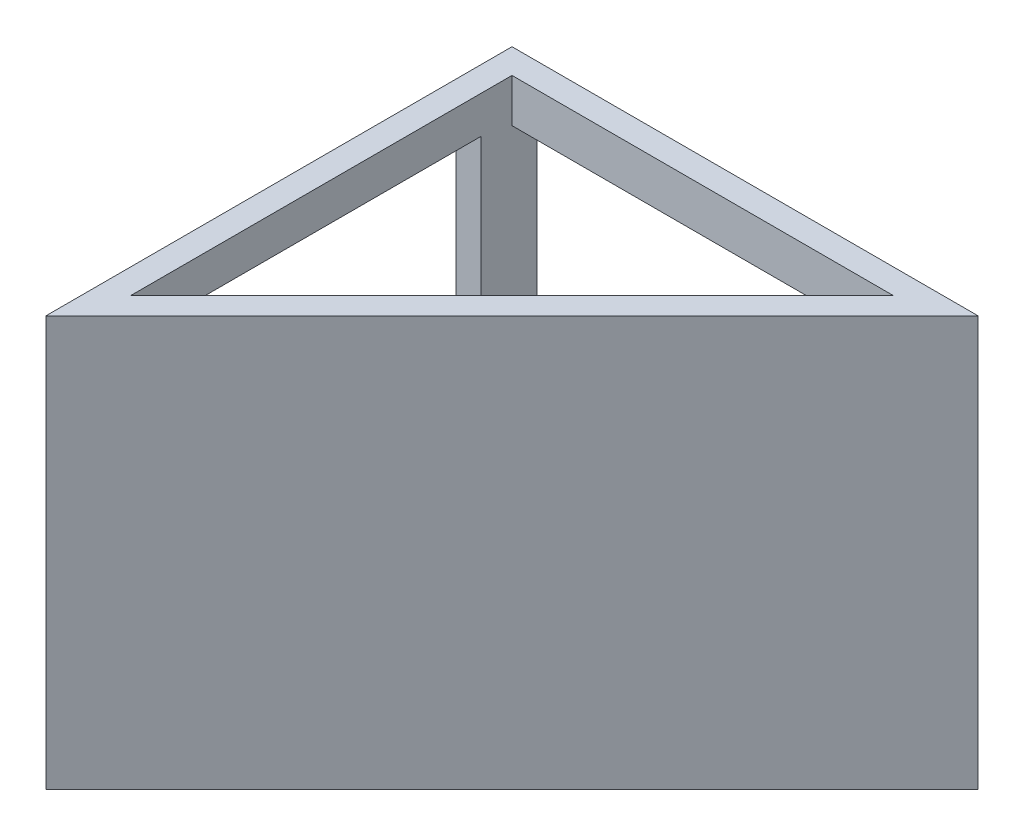
ISO-10303-21;
HEADER;
FILE_DESCRIPTION(('STEP AP214'),'2;1');
FILE_NAME('part.step','',(''),(''),'','','');
FILE_SCHEMA(('AUTOMOTIVE_DESIGN { 1 0 10303 214 1 1 1 1 }'));
ENDSEC;
DATA;
#1=APPLICATION_CONTEXT('core data for automotive mechanical design processes');
#2=APPLICATION_PROTOCOL_DEFINITION('international standard','automotive_design',2000,#1);
#3=PRODUCT_CONTEXT('',#1,'mechanical');
#4=PRODUCT('Part','Part','',(#3));
#5=PRODUCT_RELATED_PRODUCT_CATEGORY('part','',(#4));
#6=PRODUCT_DEFINITION_FORMATION('','',#4);
#7=PRODUCT_DEFINITION_CONTEXT('part definition',#1,'design');
#8=PRODUCT_DEFINITION('design','',#6,#7);
#9=PRODUCT_DEFINITION_SHAPE('','',#8);
#10=(LENGTH_UNIT() NAMED_UNIT(*) SI_UNIT(.MILLI.,.METRE.));
#11=(NAMED_UNIT(*) PLANE_ANGLE_UNIT() SI_UNIT($,.RADIAN.));
#12=(NAMED_UNIT(*) SI_UNIT($,.STERADIAN.) SOLID_ANGLE_UNIT());
#13=UNCERTAINTY_MEASURE_WITH_UNIT(LENGTH_MEASURE(1.E-05),#10,'distance_accuracy_value','');
#14=(GEOMETRIC_REPRESENTATION_CONTEXT(3) GLOBAL_UNCERTAINTY_ASSIGNED_CONTEXT((#13)) GLOBAL_UNIT_ASSIGNED_CONTEXT((#10,
#11,#12)) REPRESENTATION_CONTEXT('',''));
#15=CARTESIAN_POINT('',(0.,0.,0.));
#16=DIRECTION('',(0.,0.,1.));
#17=DIRECTION('',(1.,0.,0.));
#18=AXIS2_PLACEMENT_3D('',#15,#16,#17);
#19=CARTESIAN_POINT('',(2.,33.,2.));
#20=DIRECTION('',(1.,0.,0.));
#21=DIRECTION('',(0.,0.,-1.));
#22=AXIS2_PLACEMENT_3D('',#19,#20,#21);
#23=PLANE('',#22);
#24=DIRECTION('',(0.,-1.,0.));
#25=VECTOR('',#24,1.);
#26=CARTESIAN_POINT('',(2.,33.,32.6715728752538));
#27=LINE('',#26,#25);
#28=CARTESIAN_POINT('',(2.,33.,32.6715728752538));
#29=VERTEX_POINT('',#28);
#30=CARTESIAN_POINT('',(2.,30.,32.6715728752538));
#31=VERTEX_POINT('',#30);
#32=EDGE_CURVE('E238',#29,#31,#27,.T.);
#33=ORIENTED_EDGE('',*,*,#32,.T.);
#34=DIRECTION('',(0.,0.,-1.));
#35=VECTOR('',#34,1.);
#36=CARTESIAN_POINT('',(2.,30.,4.5));
#37=LINE('',#36,#35);
#38=CARTESIAN_POINT('',(2.,30.,4.5));
#39=VERTEX_POINT('',#38);
#40=EDGE_CURVE('E166',#31,#39,#37,.T.);
#41=ORIENTED_EDGE('',*,*,#40,.T.);
#42=DIRECTION('',(0.,-1.,0.));
#43=VECTOR('',#42,1.);
#44=CARTESIAN_POINT('',(2.,30.,4.5));
#45=LINE('',#44,#43);
#46=CARTESIAN_POINT('',(2.,5.,4.5));
#47=VERTEX_POINT('',#46);
#48=EDGE_CURVE('E154',#39,#47,#45,.T.);
#49=ORIENTED_EDGE('',*,*,#48,.T.);
#50=DIRECTION('',(0.,0.,1.));
#51=VECTOR('',#50,1.);
#52=CARTESIAN_POINT('',(2.,5.,4.5));
#53=LINE('',#52,#51);
#54=CARTESIAN_POINT('',(2.,5.,32.6715728752538));
#55=VERTEX_POINT('',#54);
#56=EDGE_CURVE('E53',#47,#55,#53,.T.);
#57=ORIENTED_EDGE('',*,*,#56,.T.);
#58=CARTESIAN_POINT('',(2.,2.,32.6715728752538));
#59=VERTEX_POINT('',#58);
#60=EDGE_CURVE('E239',#55,#59,#27,.T.);
#61=ORIENTED_EDGE('',*,*,#60,.T.);
#62=DIRECTION('',(0.,0.,-1.));
#63=VECTOR('',#62,1.);
#64=CARTESIAN_POINT('',(2.,2.,2.));
#65=LINE('',#64,#63);
#66=CARTESIAN_POINT('',(2.,2.,2.));
#67=VERTEX_POINT('',#66);
#68=EDGE_CURVE('E209',#59,#67,#65,.T.);
#69=ORIENTED_EDGE('',*,*,#68,.T.);
#70=DIRECTION('',(0.,-1.,0.));
#71=VECTOR('',#70,1.);
#72=CARTESIAN_POINT('',(2.,33.,2.));
#73=LINE('',#72,#71);
#74=CARTESIAN_POINT('',(2.,3.,2.));
#75=VERTEX_POINT('',#74);
#76=EDGE_CURVE('E234',#75,#67,#73,.T.);
#77=ORIENTED_EDGE('',*,*,#76,.F.);
#78=DIRECTION('',(0.,0.,-1.));
#79=VECTOR('',#78,1.);
#80=CARTESIAN_POINT('',(2.,3.,2.));
#81=LINE('',#80,#79);
#82=CARTESIAN_POINT('',(2.,3.,0.));
#83=VERTEX_POINT('',#82);
#84=EDGE_CURVE('E213',#75,#83,#81,.T.);
#85=ORIENTED_EDGE('',*,*,#84,.T.);
#86=DIRECTION('',(0.,1.,0.));
#87=VECTOR('',#86,1.);
#88=CARTESIAN_POINT('',(2.,29.5,0.));
#89=LINE('',#88,#87);
#90=CARTESIAN_POINT('',(2.,29.5,0.));
#91=VERTEX_POINT('',#90);
#92=EDGE_CURVE('E201',#83,#91,#89,.T.);
#93=ORIENTED_EDGE('',*,*,#92,.T.);
#94=DIRECTION('',(0.,0.,-1.));
#95=VECTOR('',#94,1.);
#96=CARTESIAN_POINT('',(2.,29.5,2.));
#97=LINE('',#96,#95);
#98=CARTESIAN_POINT('',(2.,29.5,2.));
#99=VERTEX_POINT('',#98);
#100=EDGE_CURVE('E211',#99,#91,#97,.T.);
#101=ORIENTED_EDGE('',*,*,#100,.F.);
#102=CARTESIAN_POINT('',(2.,33.,2.));
#103=VERTEX_POINT('',#102);
#104=EDGE_CURVE('E235',#103,#99,#73,.T.);
#105=ORIENTED_EDGE('',*,*,#104,.F.);
#106=DIRECTION('',(0.,0.,1.));
#107=VECTOR('',#106,1.);
#108=CARTESIAN_POINT('',(2.,33.,2.));
#109=LINE('',#108,#107);
#110=EDGE_CURVE('E223',#103,#29,#109,.T.);
#111=ORIENTED_EDGE('',*,*,#110,.T.);
#112=EDGE_LOOP('',(#33,#41,#49,#57,#61,#69,#77,#85,#93,#101,#105,#111));
#113=FACE_BOUND('',#112,.T.);
#114=ADVANCED_FACE('F39',(#113),#23,.T.);
#115=CARTESIAN_POINT('',(2.,33.,2.));
#116=DIRECTION('',(0.,0.,1.));
#117=DIRECTION('',(1.,0.,0.));
#118=AXIS2_PLACEMENT_3D('',#115,#116,#117);
#119=PLANE('',#118);
#120=ORIENTED_EDGE('',*,*,#104,.T.);
#121=DIRECTION('',(1.,0.,0.));
#122=VECTOR('',#121,1.);
#123=CARTESIAN_POINT('',(31.,29.5,2.));
#124=LINE('',#123,#122);
#125=CARTESIAN_POINT('',(31.,29.5,2.));
#126=VERTEX_POINT('',#125);
#127=EDGE_CURVE('E193',#99,#126,#124,.T.);
#128=ORIENTED_EDGE('',*,*,#127,.T.);
#129=DIRECTION('',(0.,-1.,0.));
#130=VECTOR('',#129,1.);
#131=CARTESIAN_POINT('',(31.,29.5,2.));
#132=LINE('',#131,#130);
#133=CARTESIAN_POINT('',(31.,3.,2.));
#134=VERTEX_POINT('',#133);
#135=EDGE_CURVE('E189',#126,#134,#132,.T.);
#136=ORIENTED_EDGE('',*,*,#135,.T.);
#137=DIRECTION('',(-1.,0.,0.));
#138=VECTOR('',#137,1.);
#139=CARTESIAN_POINT('',(31.,3.,2.));
#140=LINE('',#139,#138);
#141=EDGE_CURVE('E192',#134,#75,#140,.T.);
#142=ORIENTED_EDGE('',*,*,#141,.T.);
#143=ORIENTED_EDGE('',*,*,#76,.T.);
#144=DIRECTION('',(1.,0.,0.));
#145=VECTOR('',#144,1.);
#146=CARTESIAN_POINT('',(32.6715728752538,2.,2.));
#147=LINE('',#146,#145);
#148=CARTESIAN_POINT('',(32.6715728752538,2.,2.));
#149=VERTEX_POINT('',#148);
#150=EDGE_CURVE('E218',#67,#149,#147,.T.);
#151=ORIENTED_EDGE('',*,*,#150,.T.);
#152=DIRECTION('',(0.,-1.,0.));
#153=VECTOR('',#152,1.);
#154=CARTESIAN_POINT('',(32.6715728752538,33.,2.));
#155=LINE('',#154,#153);
#156=CARTESIAN_POINT('',(32.6715728752538,33.,2.));
#157=VERTEX_POINT('',#156);
#158=EDGE_CURVE('E237',#157,#149,#155,.T.);
#159=ORIENTED_EDGE('',*,*,#158,.F.);
#160=DIRECTION('',(-1.,0.,0.));
#161=VECTOR('',#160,1.);
#162=CARTESIAN_POINT('',(2.,33.,2.));
#163=LINE('',#162,#161);
#164=EDGE_CURVE('E228',#157,#103,#163,.T.);
#165=ORIENTED_EDGE('',*,*,#164,.T.);
#166=EDGE_LOOP('',(#120,#128,#136,#142,#143,#151,#159,#165));
#167=FACE_BOUND('',#166,.T.);
#168=ADVANCED_FACE('F286',(#167),#119,.T.);
#169=CARTESIAN_POINT('',(2.,33.,32.6715728752538));
#170=DIRECTION('',(-0.707106781186548,0.,-0.707106781186547));
#171=DIRECTION('',(-0.707106781186547,0.,0.707106781186548));
#172=AXIS2_PLACEMENT_3D('',#169,#170,#171);
#173=PLANE('',#172);
#174=ORIENTED_EDGE('',*,*,#158,.T.);
#175=DIRECTION('',(-0.707106781186547,0.,0.707106781186548));
#176=VECTOR('',#175,1.);
#177=CARTESIAN_POINT('',(2.,2.,32.6715728752538));
#178=LINE('',#177,#176);
#179=EDGE_CURVE('E225',#149,#59,#178,.T.);
#180=ORIENTED_EDGE('',*,*,#179,.T.);
#181=ORIENTED_EDGE('',*,*,#60,.F.);
#182=EDGE_CURVE('E152',#31,#55,#27,.T.);
#183=ORIENTED_EDGE('',*,*,#182,.F.);
#184=ORIENTED_EDGE('',*,*,#32,.F.);
#185=DIRECTION('',(0.707106781186547,0.,-0.707106781186548));
#186=VECTOR('',#185,1.);
#187=CARTESIAN_POINT('',(2.,33.,32.6715728752538));
#188=LINE('',#187,#186);
#189=EDGE_CURVE('E230',#29,#157,#188,.T.);
#190=ORIENTED_EDGE('',*,*,#189,.T.);
#191=EDGE_LOOP('',(#174,#180,#181,#183,#184,#190));
#192=FACE_BOUND('',#191,.T.);
#193=ADVANCED_FACE('F300',(#192),#173,.T.);
#194=CARTESIAN_POINT('',(0.,33.,0.));
#195=DIRECTION('',(0.,1.,0.));
#196=DIRECTION('',(0.,0.,1.));
#197=AXIS2_PLACEMENT_3D('',#194,#195,#196);
#198=PLANE('',#197);
#199=DIRECTION('',(0.,0.,1.));
#200=VECTOR('',#199,1.);
#201=CARTESIAN_POINT('',(0.,33.,0.));
#202=LINE('',#201,#200);
#203=CARTESIAN_POINT('',(0.,33.,0.));
#204=VERTEX_POINT('',#203);
#205=CARTESIAN_POINT('',(0.,33.,37.5));
#206=VERTEX_POINT('',#205);
#207=EDGE_CURVE('E241',#204,#206,#202,.T.);
#208=ORIENTED_EDGE('',*,*,#207,.T.);
#209=DIRECTION('',(0.707106781186548,0.,-0.707106781186548));
#210=VECTOR('',#209,1.);
#211=CARTESIAN_POINT('',(0.,33.,37.5));
#212=LINE('',#211,#210);
#213=CARTESIAN_POINT('',(37.5,33.,0.));
#214=VERTEX_POINT('',#213);
#215=EDGE_CURVE('E249',#206,#214,#212,.T.);
#216=ORIENTED_EDGE('',*,*,#215,.T.);
#217=DIRECTION('',(-1.,0.,0.));
#218=VECTOR('',#217,1.);
#219=CARTESIAN_POINT('',(0.,33.,0.));
#220=LINE('',#219,#218);
#221=EDGE_CURVE('E248',#214,#204,#220,.T.);
#222=ORIENTED_EDGE('',*,*,#221,.T.);
#223=EDGE_LOOP('',(#208,#216,#222));
#224=FACE_BOUND('',#223,.T.);
#225=ORIENTED_EDGE('',*,*,#189,.F.);
#226=ORIENTED_EDGE('',*,*,#110,.F.);
#227=ORIENTED_EDGE('',*,*,#164,.F.);
#228=EDGE_LOOP('',(#225,#226,#227));
#229=FACE_BOUND('',#228,.T.);
#230=ADVANCED_FACE('F273',(#224,#229),#198,.T.);
#231=CARTESIAN_POINT('',(0.,0.,0.));
#232=DIRECTION('',(0.,1.,0.));
#233=DIRECTION('',(0.,0.,1.));
#234=AXIS2_PLACEMENT_3D('',#231,#232,#233);
#235=PLANE('',#234);
#236=DIRECTION('',(0.,0.,1.));
#237=VECTOR('',#236,1.);
#238=CARTESIAN_POINT('',(0.,0.,0.));
#239=LINE('',#238,#237);
#240=CARTESIAN_POINT('',(0.,0.,0.));
#241=VERTEX_POINT('',#240);
#242=CARTESIAN_POINT('',(0.,0.,37.5));
#243=VERTEX_POINT('',#242);
#244=EDGE_CURVE('E244',#241,#243,#239,.T.);
#245=ORIENTED_EDGE('',*,*,#244,.F.);
#246=DIRECTION('',(-1.,0.,0.));
#247=VECTOR('',#246,1.);
#248=CARTESIAN_POINT('',(0.,0.,0.));
#249=LINE('',#248,#247);
#250=CARTESIAN_POINT('',(37.5,0.,0.));
#251=VERTEX_POINT('',#250);
#252=EDGE_CURVE('E250',#251,#241,#249,.T.);
#253=ORIENTED_EDGE('',*,*,#252,.F.);
#254=DIRECTION('',(0.707106781186548,0.,-0.707106781186548));
#255=VECTOR('',#254,1.);
#256=CARTESIAN_POINT('',(0.,0.,37.5));
#257=LINE('',#256,#255);
#258=EDGE_CURVE('E254',#243,#251,#257,.T.);
#259=ORIENTED_EDGE('',*,*,#258,.F.);
#260=EDGE_LOOP('',(#245,#253,#259));
#261=FACE_BOUND('',#260,.T.);
#262=ADVANCED_FACE('F267',(#261),#235,.F.);
#263=CARTESIAN_POINT('',(0.,33.,0.));
#264=DIRECTION('',(1.,0.,0.));
#265=DIRECTION('',(0.,0.,-1.));
#266=AXIS2_PLACEMENT_3D('',#263,#264,#265);
#267=PLANE('',#266);
#268=DIRECTION('',(0.,0.,1.));
#269=VECTOR('',#268,1.);
#270=CARTESIAN_POINT('',(0.,5.,4.5));
#271=LINE('',#270,#269);
#272=CARTESIAN_POINT('',(0.,5.,4.5));
#273=VERTEX_POINT('',#272);
#274=CARTESIAN_POINT('',(0.,5.,33.));
#275=VERTEX_POINT('',#274);
#276=EDGE_CURVE('E161',#273,#275,#271,.T.);
#277=ORIENTED_EDGE('',*,*,#276,.F.);
#278=DIRECTION('',(0.,-1.,0.));
#279=VECTOR('',#278,1.);
#280=CARTESIAN_POINT('',(0.,30.,4.5));
#281=LINE('',#280,#279);
#282=CARTESIAN_POINT('',(0.,30.,4.5));
#283=VERTEX_POINT('',#282);
#284=EDGE_CURVE('E62',#283,#273,#281,.T.);
#285=ORIENTED_EDGE('',*,*,#284,.F.);
#286=DIRECTION('',(0.,0.,-1.));
#287=VECTOR('',#286,1.);
#288=CARTESIAN_POINT('',(0.,30.,4.5));
#289=LINE('',#288,#287);
#290=CARTESIAN_POINT('',(0.,30.,33.));
#291=VERTEX_POINT('',#290);
#292=EDGE_CURVE('E178',#291,#283,#289,.T.);
#293=ORIENTED_EDGE('',*,*,#292,.F.);
#294=DIRECTION('',(0.,1.,0.));
#295=VECTOR('',#294,1.);
#296=CARTESIAN_POINT('',(0.,30.,33.));
#297=LINE('',#296,#295);
#298=EDGE_CURVE('E180',#275,#291,#297,.T.);
#299=ORIENTED_EDGE('',*,*,#298,.F.);
#300=EDGE_LOOP('',(#277,#285,#293,#299));
#301=FACE_BOUND('',#300,.T.);
#302=ORIENTED_EDGE('',*,*,#244,.T.);
#303=DIRECTION('',(0.,-1.,0.));
#304=VECTOR('',#303,1.);
#305=CARTESIAN_POINT('',(0.,33.,37.5));
#306=LINE('',#305,#304);
#307=EDGE_CURVE('E11',#206,#243,#306,.T.);
#308=ORIENTED_EDGE('',*,*,#307,.F.);
#309=ORIENTED_EDGE('',*,*,#207,.F.);
#310=DIRECTION('',(0.,-1.,0.));
#311=VECTOR('',#310,1.);
#312=CARTESIAN_POINT('',(0.,33.,0.));
#313=LINE('',#312,#311);
#314=EDGE_CURVE('E252',#204,#241,#313,.T.);
#315=ORIENTED_EDGE('',*,*,#314,.T.);
#316=EDGE_LOOP('',(#302,#308,#309,#315));
#317=FACE_BOUND('',#316,.T.);
#318=ADVANCED_FACE('F41',(#301,#317),#267,.F.);
#319=CARTESIAN_POINT('',(0.,33.,37.5));
#320=DIRECTION('',(-0.707106781186547,0.,-0.707106781186547));
#321=DIRECTION('',(-0.707106781186548,0.,0.707106781186548));
#322=AXIS2_PLACEMENT_3D('',#319,#320,#321);
#323=PLANE('',#322);
#324=ORIENTED_EDGE('',*,*,#258,.T.);
#325=DIRECTION('',(0.,-1.,0.));
#326=VECTOR('',#325,1.);
#327=CARTESIAN_POINT('',(37.5,33.,0.));
#328=LINE('',#327,#326);
#329=EDGE_CURVE('E50',#214,#251,#328,.T.);
#330=ORIENTED_EDGE('',*,*,#329,.F.);
#331=ORIENTED_EDGE('',*,*,#215,.F.);
#332=ORIENTED_EDGE('',*,*,#307,.T.);
#333=EDGE_LOOP('',(#324,#330,#331,#332));
#334=FACE_BOUND('',#333,.T.);
#335=ADVANCED_FACE('F277',(#334),#323,.F.);
#336=CARTESIAN_POINT('',(0.,33.,0.));
#337=DIRECTION('',(0.,0.,1.));
#338=DIRECTION('',(1.,0.,0.));
#339=AXIS2_PLACEMENT_3D('',#336,#337,#338);
#340=PLANE('',#339);
#341=DIRECTION('',(-1.,0.,0.));
#342=VECTOR('',#341,1.);
#343=CARTESIAN_POINT('',(31.,3.,0.));
#344=LINE('',#343,#342);
#345=CARTESIAN_POINT('',(31.,3.,0.));
#346=VERTEX_POINT('',#345);
#347=EDGE_CURVE('E199',#346,#83,#344,.T.);
#348=ORIENTED_EDGE('',*,*,#347,.F.);
#349=DIRECTION('',(0.,-1.,0.));
#350=VECTOR('',#349,1.);
#351=CARTESIAN_POINT('',(31.,29.5,0.));
#352=LINE('',#351,#350);
#353=CARTESIAN_POINT('',(31.,29.5,0.));
#354=VERTEX_POINT('',#353);
#355=EDGE_CURVE('E183',#354,#346,#352,.T.);
#356=ORIENTED_EDGE('',*,*,#355,.F.);
#357=DIRECTION('',(1.,0.,0.));
#358=VECTOR('',#357,1.);
#359=CARTESIAN_POINT('',(31.,29.5,0.));
#360=LINE('',#359,#358);
#361=EDGE_CURVE('E194',#91,#354,#360,.T.);
#362=ORIENTED_EDGE('',*,*,#361,.F.);
#363=ORIENTED_EDGE('',*,*,#92,.F.);
#364=EDGE_LOOP('',(#348,#356,#362,#363));
#365=FACE_BOUND('',#364,.T.);
#366=ORIENTED_EDGE('',*,*,#252,.T.);
#367=ORIENTED_EDGE('',*,*,#314,.F.);
#368=ORIENTED_EDGE('',*,*,#221,.F.);
#369=ORIENTED_EDGE('',*,*,#329,.T.);
#370=EDGE_LOOP('',(#366,#367,#368,#369));
#371=FACE_BOUND('',#370,.T.);
#372=ADVANCED_FACE('F262',(#365,#371),#340,.F.);
#373=CARTESIAN_POINT('',(0.,2.,0.));
#374=DIRECTION('',(0.,-1.,0.));
#375=DIRECTION('',(0.,0.,-1.));
#376=AXIS2_PLACEMENT_3D('',#373,#374,#375);
#377=PLANE('',#376);
#378=ORIENTED_EDGE('',*,*,#68,.F.);
#379=ORIENTED_EDGE('',*,*,#179,.F.);
#380=ORIENTED_EDGE('',*,*,#150,.F.);
#381=EDGE_LOOP('',(#378,#379,#380));
#382=FACE_BOUND('',#381,.T.);
#383=ADVANCED_FACE('F284',(#382),#377,.F.);
#384=CARTESIAN_POINT('',(31.,29.5,2.));
#385=DIRECTION('',(1.,0.,0.));
#386=DIRECTION('',(0.,1.,0.));
#387=AXIS2_PLACEMENT_3D('',#384,#385,#386);
#388=PLANE('',#387);
#389=ORIENTED_EDGE('',*,*,#355,.T.);
#390=DIRECTION('',(0.,0.,-1.));
#391=VECTOR('',#390,1.);
#392=CARTESIAN_POINT('',(31.,3.,2.));
#393=LINE('',#392,#391);
#394=EDGE_CURVE('E196',#134,#346,#393,.T.);
#395=ORIENTED_EDGE('',*,*,#394,.F.);
#396=ORIENTED_EDGE('',*,*,#135,.F.);
#397=DIRECTION('',(0.,0.,-1.));
#398=VECTOR('',#397,1.);
#399=CARTESIAN_POINT('',(31.,29.5,2.));
#400=LINE('',#399,#398);
#401=EDGE_CURVE('E208',#126,#354,#400,.T.);
#402=ORIENTED_EDGE('',*,*,#401,.T.);
#403=EDGE_LOOP('',(#389,#395,#396,#402));
#404=FACE_BOUND('',#403,.T.);
#405=ADVANCED_FACE('F315',(#404),#388,.F.);
#406=CARTESIAN_POINT('',(31.,29.5,2.));
#407=DIRECTION('',(0.,1.,0.));
#408=DIRECTION('',(0.,0.,1.));
#409=AXIS2_PLACEMENT_3D('',#406,#407,#408);
#410=PLANE('',#409);
#411=ORIENTED_EDGE('',*,*,#361,.T.);
#412=ORIENTED_EDGE('',*,*,#401,.F.);
#413=ORIENTED_EDGE('',*,*,#127,.F.);
#414=ORIENTED_EDGE('',*,*,#100,.T.);
#415=EDGE_LOOP('',(#411,#412,#413,#414));
#416=FACE_BOUND('',#415,.T.);
#417=ADVANCED_FACE('F335',(#416),#410,.F.);
#418=CARTESIAN_POINT('',(31.,3.,2.));
#419=DIRECTION('',(0.,-1.,0.));
#420=DIRECTION('',(1.,0.,0.));
#421=AXIS2_PLACEMENT_3D('',#418,#419,#420);
#422=PLANE('',#421);
#423=ORIENTED_EDGE('',*,*,#347,.T.);
#424=ORIENTED_EDGE('',*,*,#84,.F.);
#425=ORIENTED_EDGE('',*,*,#141,.F.);
#426=ORIENTED_EDGE('',*,*,#394,.T.);
#427=EDGE_LOOP('',(#423,#424,#425,#426));
#428=FACE_BOUND('',#427,.T.);
#429=ADVANCED_FACE('F338',(#428),#422,.F.);
#430=CARTESIAN_POINT('',(2.,0.,0.));
#431=DIRECTION('',(-1.,0.,0.));
#432=DIRECTION('',(0.,0.,1.));
#433=AXIS2_PLACEMENT_3D('',#430,#431,#432);
#434=PLANE('',#433);
#435=ORIENTED_EDGE('',*,*,#182,.T.);
#436=CARTESIAN_POINT('',(2.,5.,33.));
#437=VERTEX_POINT('',#436);
#438=EDGE_CURVE('E148',#55,#437,#53,.T.);
#439=ORIENTED_EDGE('',*,*,#438,.T.);
#440=DIRECTION('',(0.,1.,0.));
#441=VECTOR('',#440,1.);
#442=CARTESIAN_POINT('',(2.,30.,33.));
#443=LINE('',#442,#441);
#444=CARTESIAN_POINT('',(2.,30.,33.));
#445=VERTEX_POINT('',#444);
#446=EDGE_CURVE('E151',#437,#445,#443,.T.);
#447=ORIENTED_EDGE('',*,*,#446,.T.);
#448=EDGE_CURVE('E175',#445,#31,#37,.T.);
#449=ORIENTED_EDGE('',*,*,#448,.T.);
#450=EDGE_LOOP('',(#435,#439,#447,#449));
#451=FACE_BOUND('',#450,.T.);
#452=ADVANCED_FACE('F146',(#451),#434,.T.);
#453=CARTESIAN_POINT('',(2.,30.,4.5));
#454=DIRECTION('',(0.,0.,-1.));
#455=DIRECTION('',(0.,1.,0.));
#456=AXIS2_PLACEMENT_3D('',#453,#454,#455);
#457=PLANE('',#456);
#458=ORIENTED_EDGE('',*,*,#284,.T.);
#459=DIRECTION('',(-1.,0.,0.));
#460=VECTOR('',#459,1.);
#461=CARTESIAN_POINT('',(2.,5.,4.5));
#462=LINE('',#461,#460);
#463=EDGE_CURVE('E167',#47,#273,#462,.T.);
#464=ORIENTED_EDGE('',*,*,#463,.F.);
#465=ORIENTED_EDGE('',*,*,#48,.F.);
#466=DIRECTION('',(-1.,0.,0.));
#467=VECTOR('',#466,1.);
#468=CARTESIAN_POINT('',(2.,30.,4.5));
#469=LINE('',#468,#467);
#470=EDGE_CURVE('E181',#39,#283,#469,.T.);
#471=ORIENTED_EDGE('',*,*,#470,.T.);
#472=EDGE_LOOP('',(#458,#464,#465,#471));
#473=FACE_BOUND('',#472,.T.);
#474=ADVANCED_FACE('F370',(#473),#457,.F.);
#475=CARTESIAN_POINT('',(2.,30.,4.5));
#476=DIRECTION('',(0.,1.,0.));
#477=DIRECTION('',(0.,0.,1.));
#478=AXIS2_PLACEMENT_3D('',#475,#476,#477);
#479=PLANE('',#478);
#480=ORIENTED_EDGE('',*,*,#292,.T.);
#481=ORIENTED_EDGE('',*,*,#470,.F.);
#482=ORIENTED_EDGE('',*,*,#40,.F.);
#483=ORIENTED_EDGE('',*,*,#448,.F.);
#484=DIRECTION('',(-1.,0.,0.));
#485=VECTOR('',#484,1.);
#486=CARTESIAN_POINT('',(2.,30.,33.));
#487=LINE('',#486,#485);
#488=EDGE_CURVE('E164',#445,#291,#487,.T.);
#489=ORIENTED_EDGE('',*,*,#488,.T.);
#490=EDGE_LOOP('',(#480,#481,#482,#483,#489));
#491=FACE_BOUND('',#490,.T.);
#492=ADVANCED_FACE('F376',(#491),#479,.F.);
#493=CARTESIAN_POINT('',(2.,30.,33.));
#494=DIRECTION('',(0.,0.,1.));
#495=DIRECTION('',(1.,0.,0.));
#496=AXIS2_PLACEMENT_3D('',#493,#494,#495);
#497=PLANE('',#496);
#498=ORIENTED_EDGE('',*,*,#298,.T.);
#499=ORIENTED_EDGE('',*,*,#488,.F.);
#500=ORIENTED_EDGE('',*,*,#446,.F.);
#501=DIRECTION('',(-1.,0.,0.));
#502=VECTOR('',#501,1.);
#503=CARTESIAN_POINT('',(2.,5.,33.));
#504=LINE('',#503,#502);
#505=EDGE_CURVE('E158',#437,#275,#504,.T.);
#506=ORIENTED_EDGE('',*,*,#505,.T.);
#507=EDGE_LOOP('',(#498,#499,#500,#506));
#508=FACE_BOUND('',#507,.T.);
#509=ADVANCED_FACE('F169',(#508),#497,.F.);
#510=CARTESIAN_POINT('',(2.,5.,4.5));
#511=DIRECTION('',(0.,-1.,0.));
#512=DIRECTION('',(0.,0.,-1.));
#513=AXIS2_PLACEMENT_3D('',#510,#511,#512);
#514=PLANE('',#513);
#515=ORIENTED_EDGE('',*,*,#276,.T.);
#516=ORIENTED_EDGE('',*,*,#505,.F.);
#517=ORIENTED_EDGE('',*,*,#438,.F.);
#518=ORIENTED_EDGE('',*,*,#56,.F.);
#519=ORIENTED_EDGE('',*,*,#463,.T.);
#520=EDGE_LOOP('',(#515,#516,#517,#518,#519));
#521=FACE_BOUND('',#520,.T.);
#522=ADVANCED_FACE('F157',(#521),#514,.F.);
#523=CLOSED_SHELL('',(#114,#168,#193,#230,#262,#318,#335,#372,#383,#405,#417,#429,#452,#474,
#492,#509,#522));
#524=MANIFOLD_SOLID_BREP('B2',#523);
#525=ADVANCED_BREP_SHAPE_REPRESENTATION('',(#18,#524),#14);
#526=SHAPE_DEFINITION_REPRESENTATION(#9,#525);
ENDSEC;
END-ISO-10303-21;
